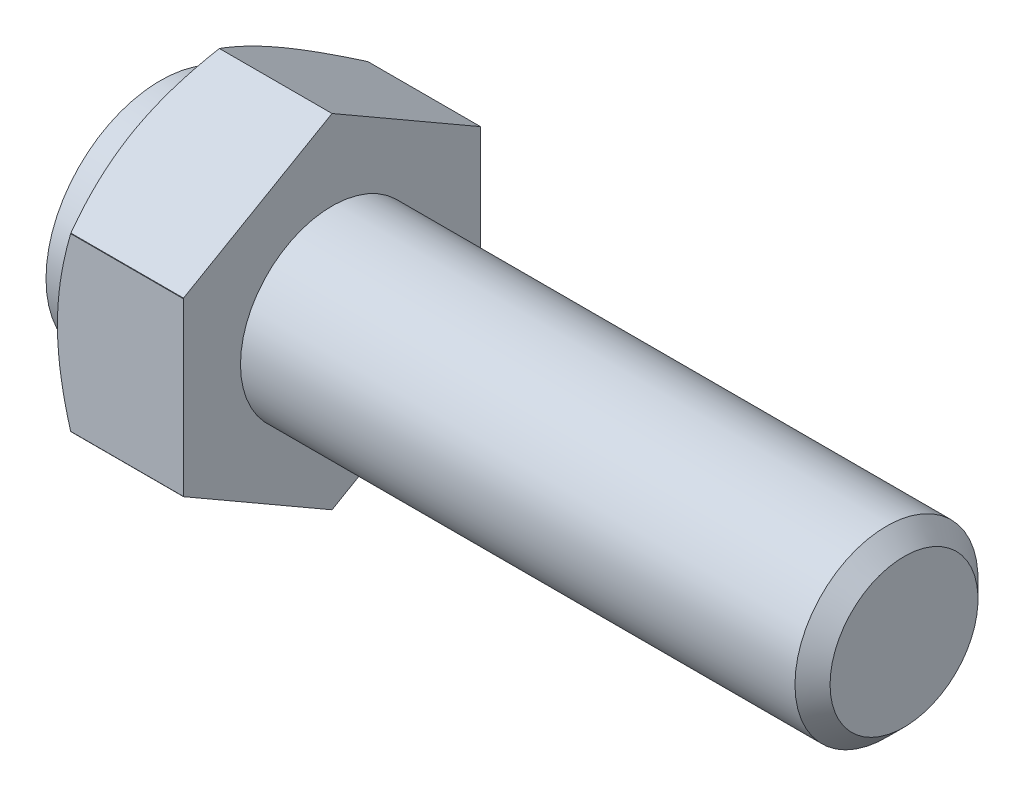
ISO-10303-21;
HEADER;
FILE_DESCRIPTION(('STEP AP214'),'2;1');
FILE_NAME('part.step','',(''),(''),'','','');
FILE_SCHEMA(('AUTOMOTIVE_DESIGN { 1 0 10303 214 1 1 1 1 }'));
ENDSEC;
DATA;
#1=APPLICATION_CONTEXT('core data for automotive mechanical design processes');
#2=APPLICATION_PROTOCOL_DEFINITION('international standard','automotive_design',2000,#1);
#3=PRODUCT_CONTEXT('',#1,'mechanical');
#4=PRODUCT('Part','Part','',(#3));
#5=PRODUCT_RELATED_PRODUCT_CATEGORY('part','',(#4));
#6=PRODUCT_DEFINITION_FORMATION('','',#4);
#7=PRODUCT_DEFINITION_CONTEXT('part definition',#1,'design');
#8=PRODUCT_DEFINITION('design','',#6,#7);
#9=PRODUCT_DEFINITION_SHAPE('','',#8);
#10=(LENGTH_UNIT() NAMED_UNIT(*) SI_UNIT(.MILLI.,.METRE.));
#11=(NAMED_UNIT(*) PLANE_ANGLE_UNIT() SI_UNIT($,.RADIAN.));
#12=(NAMED_UNIT(*) SI_UNIT($,.STERADIAN.) SOLID_ANGLE_UNIT());
#13=UNCERTAINTY_MEASURE_WITH_UNIT(LENGTH_MEASURE(1.E-05),#10,'distance_accuracy_value','');
#14=(GEOMETRIC_REPRESENTATION_CONTEXT(3) GLOBAL_UNCERTAINTY_ASSIGNED_CONTEXT((#13)) GLOBAL_UNIT_ASSIGNED_CONTEXT((#10,
#11,#12)) REPRESENTATION_CONTEXT('',''));
#15=CARTESIAN_POINT('',(0.,0.,0.));
#16=DIRECTION('',(0.,0.,1.));
#17=DIRECTION('',(1.,0.,0.));
#18=AXIS2_PLACEMENT_3D('',#15,#16,#17);
#19=CARTESIAN_POINT('',(-5.5,5.,0.));
#20=DIRECTION('',(1.,0.,0.));
#21=DIRECTION('',(0.,0.,-1.));
#22=AXIS2_PLACEMENT_3D('',#19,#20,#21);
#23=PLANE('',#22);
#24=CARTESIAN_POINT('',(-5.5,0.,0.));
#25=DIRECTION('',(-1.,0.,0.));
#26=DIRECTION('',(0.,0.,1.));
#27=AXIS2_PLACEMENT_3D('',#24,#25,#26);
#28=CIRCLE('',#27,5.);
#29=CARTESIAN_POINT('',(-5.5,0.,5.));
#30=VERTEX_POINT('',#29);
#31=EDGE_CURVE('E162',#30,#30,#28,.T.);
#32=ORIENTED_EDGE('',*,*,#31,.F.);
#33=EDGE_LOOP('',(#32));
#34=FACE_BOUND('',#33,.T.);
#35=DIRECTION('',(0.,-0.499444752972083,0.866345738564376));
#36=VECTOR('',#35,1.);
#37=CARTESIAN_POINT('',(-5.5,7.5,0.));
#38=LINE('',#37,#36);
#39=CARTESIAN_POINT('',(-5.5,5.71750123357074,3.09195401714145));
#40=VERTEX_POINT('',#39);
#41=CARTESIAN_POINT('',(-5.5,5.54082284735908,3.39842348364409));
#42=VERTEX_POINT('',#41);
#43=EDGE_CURVE('E42',#40,#42,#38,.T.);
#44=ORIENTED_EDGE('',*,*,#43,.F.);
#45=CARTESIAN_POINT('',(-5.5,0.,0.));
#46=DIRECTION('',(-1.,0.,0.));
#47=DIRECTION('',(0.,0.,1.));
#48=AXIS2_PLACEMENT_3D('',#45,#46,#47);
#49=CIRCLE('',#48,6.5);
#50=CARTESIAN_POINT('',(-5.5,5.71750123357073,-3.09195401714146));
#51=VERTEX_POINT('',#50);
#52=EDGE_CURVE('E242',#40,#51,#49,.T.);
#53=ORIENTED_EDGE('',*,*,#52,.T.);
#54=DIRECTION('',(0.,0.499444752972083,0.866345738564376));
#55=VECTOR('',#54,1.);
#56=CARTESIAN_POINT('',(-5.5,3.75277674973257,-6.5));
#57=LINE('',#56,#55);
#58=CARTESIAN_POINT('',(-5.5,5.5408228473591,-3.39842348364405));
#59=VERTEX_POINT('',#58);
#60=EDGE_CURVE('E178',#59,#51,#57,.T.);
#61=ORIENTED_EDGE('',*,*,#60,.F.);
#62=CARTESIAN_POINT('',(-5.5,0.,-6.5));
#63=VERTEX_POINT('',#62);
#64=EDGE_CURVE('E233',#59,#63,#49,.T.);
#65=ORIENTED_EDGE('',*,*,#64,.T.);
#66=CARTESIAN_POINT('',(-5.5,-5.54082284735908,-3.39842348364409));
#67=VERTEX_POINT('',#66);
#68=EDGE_CURVE('E236',#63,#67,#49,.T.);
#69=ORIENTED_EDGE('',*,*,#68,.T.);
#70=DIRECTION('',(0.,0.499444752972083,-0.866345738564376));
#71=VECTOR('',#70,1.);
#72=CARTESIAN_POINT('',(-5.5,-7.5,0.));
#73=LINE('',#72,#71);
#74=CARTESIAN_POINT('',(-5.5,-5.71750123357074,-3.09195401714145));
#75=VERTEX_POINT('',#74);
#76=EDGE_CURVE('E176',#75,#67,#73,.T.);
#77=ORIENTED_EDGE('',*,*,#76,.F.);
#78=CARTESIAN_POINT('',(-5.5,-5.71750123357073,3.09195401714146));
#79=VERTEX_POINT('',#78);
#80=EDGE_CURVE('E160',#75,#79,#49,.T.);
#81=ORIENTED_EDGE('',*,*,#80,.T.);
#82=DIRECTION('',(0.,-0.499444752972083,-0.866345738564376));
#83=VECTOR('',#82,1.);
#84=CARTESIAN_POINT('',(-5.5,-3.75277674973257,6.5));
#85=LINE('',#84,#83);
#86=CARTESIAN_POINT('',(-5.5,-5.5408228473591,3.39842348364405));
#87=VERTEX_POINT('',#86);
#88=EDGE_CURVE('E172',#87,#79,#85,.T.);
#89=ORIENTED_EDGE('',*,*,#88,.F.);
#90=CARTESIAN_POINT('',(-5.5,0.,6.5));
#91=VERTEX_POINT('',#90);
#92=EDGE_CURVE('E156',#87,#91,#49,.T.);
#93=ORIENTED_EDGE('',*,*,#92,.T.);
#94=EDGE_CURVE('E161',#91,#42,#49,.T.);
#95=ORIENTED_EDGE('',*,*,#94,.T.);
#96=EDGE_LOOP('',(#44,#53,#61,#65,#69,#77,#81,#89,#93,#95));
#97=FACE_BOUND('',#96,.T.);
#98=ADVANCED_FACE('F38',(#34,#97),#23,.F.);
#99=CARTESIAN_POINT('',(-4.92264973081037,0.,0.));
#100=DIRECTION('',(1.,0.,0.));
#101=DIRECTION('',(0.,0.,-1.));
#102=AXIS2_PLACEMENT_3D('',#99,#100,#101);
#103=CONICAL_SURFACE('',#102,7.5,1.0471975511966);
#104=CARTESIAN_POINT('',(-2.86380133186581,10.102980208265,-4.51517569776894));
#105=CARTESIAN_POINT('',(-2.9739356639875,9.98525603106327,-4.31096924923231));
#106=CARTESIAN_POINT('',(-3.08288066516859,9.86724998238417,-4.10627386142498));
#107=CARTESIAN_POINT('',(-3.29783343927706,9.63055528201522,-3.69569903050495));
#108=CARTESIAN_POINT('',(-3.40384084164709,9.51186654646902,-3.48981944193353));
#109=CARTESIAN_POINT('',(-3.6126669221049,9.27333445138019,-3.07605743350055));
#110=CARTESIAN_POINT('',(-3.71547425761391,9.15348860700929,-2.86817070341175));
#111=CARTESIAN_POINT('',(-3.91677539363357,8.9128985769503,-2.45083896443093));
#112=CARTESIAN_POINT('',(-4.01526933132566,8.79215441997484,-2.24139400534436));
#113=CARTESIAN_POINT('',(-4.20943195731407,8.54654648992904,-1.81535812792934));
#114=CARTESIAN_POINT('',(-4.30496548916255,8.42165593954939,-1.59872076120458));
#115=CARTESIAN_POINT('',(-4.48922042129194,8.17061464657245,-1.16326007595353));
#116=CARTESIAN_POINT('',(-4.57794148865461,8.04446384272786,-0.944436651186592));
#117=CARTESIAN_POINT('',(-4.74688101006331,7.79087299726346,-0.50455346691115));
#118=CARTESIAN_POINT('',(-4.82710767013965,7.66343433263208,-0.283496095951239));
#119=CARTESIAN_POINT('',(-4.97720499092093,7.40706079741462,0.161213991389984));
#120=CARTESIAN_POINT('',(-5.04707698848663,7.27812612229594,0.384866368710066));
#121=CARTESIAN_POINT('',(-5.19820163120515,6.96975356433922,0.919774884389156));
#122=CARTESIAN_POINT('',(-5.27381771705955,6.78959706098684,1.2322775546549));
#123=CARTESIAN_POINT('',(-5.36466840268587,6.51751661186548,1.70423313380611));
#124=CARTESIAN_POINT('',(-5.39118946882856,6.42651705295643,1.86208258482737));
#125=CARTESIAN_POINT('',(-5.43603982848086,6.2440197627889,2.17864562547467));
#126=CARTESIAN_POINT('',(-5.45437022209799,6.15252210010379,2.33735909615213));
#127=CARTESIAN_POINT('',(-5.48215434446047,5.97025128035055,2.65352929719674));
#128=CARTESIAN_POINT('',(-5.49170804912341,5.87948194414424,2.81097939982912));
#129=CARTESIAN_POINT('',(-5.50201589672274,5.6978182728382,3.12609643039434));
#130=CARTESIAN_POINT('',(-5.50277013114501,5.60692393904787,3.28376335605588));
#131=CARTESIAN_POINT('',(-5.49545499753871,5.42522467476356,3.59894212683335));
#132=CARTESIAN_POINT('',(-5.48738566544431,5.33441974390698,3.75645397257823));
#133=CARTESIAN_POINT('',(-5.46266756854949,5.15309236874645,4.07098765787691));
#134=CARTESIAN_POINT('',(-5.44601749744787,5.06256996956567,4.22800941915922));
#135=CARTESIAN_POINT('',(-5.39695873160083,4.84867292069102,4.5990390389146));
#136=CARTESIAN_POINT('',(-5.36100237129721,4.72549968761225,4.81269751654996));
#137=CARTESIAN_POINT('',(-5.27555649758671,4.48033320823007,5.23796764580379));
#138=CARTESIAN_POINT('',(-5.22606500616289,4.35834013709493,5.44957899357225));
#139=CARTESIAN_POINT('',(-5.1154173199135,4.11554861568663,5.87072947854572));
#140=CARTESIAN_POINT('',(-5.05424792708402,3.9947516813065,6.08026598625574));
#141=CARTESIAN_POINT('',(-4.92217129515758,3.75451417855719,6.49698622510435));
#142=CARTESIAN_POINT('',(-4.85126467396609,3.63507352464141,6.70417010463359));
#143=CARTESIAN_POINT('',(-4.70050433810487,3.39604993504458,7.118784668169));
#144=CARTESIAN_POINT('',(-4.62055392765062,3.27648231951587,7.32618877756686));
#145=CARTESIAN_POINT('',(-4.45394592653031,3.03861378268059,7.73879976606853));
#146=CARTESIAN_POINT('',(-4.36729278765593,2.92031207903058,7.9440080022392));
#147=CARTESIAN_POINT('',(-4.18846874847785,2.68478673562873,8.35255444579649));
#148=CARTESIAN_POINT('',(-4.09629901231353,2.56756287440657,8.55589303734951));
#149=CARTESIAN_POINT('',(-3.90740756080311,2.33403398373776,8.96097639853939));
#150=CARTESIAN_POINT('',(-3.81068576311745,2.21772897095611,9.16272113926889));
#151=CARTESIAN_POINT('',(-3.64365592793772,2.02139142837293,9.50329172755706));
#152=CARTESIAN_POINT('',(-3.57432307360361,1.94115108119484,9.64247805882792));
#153=CARTESIAN_POINT('',(-3.43406336540674,1.78102184473308,9.92024107626414));
#154=CARTESIAN_POINT('',(-3.3631365637484,1.70113294404113,10.0588177822185));
#155=CARTESIAN_POINT('',(-3.22063274733562,1.54251177636479,10.3339648767565));
#156=CARTESIAN_POINT('',(-3.14907048529663,1.46377619839329,10.4705410086371));
#157=CARTESIAN_POINT('',(-3.00472061590374,1.30658397762761,10.743209426486));
#158=CARTESIAN_POINT('',(-2.93193298752434,1.22812733964767,10.8793017041033));
#159=CARTESIAN_POINT('',(-2.85860941432732,1.1497965414676,11.0151756977689));
#160=B_SPLINE_CURVE_WITH_KNOTS('',3,(#104,#105,#106,#107,#108,#109,#110,#111,#112,#113,#114,
#115,#116,#117,#118,#119,#120,#121,#122,#123,#124,#125,#126,#127,#128,#129,#130,#131,#132,#133,
#134,#135,#136,#137,#138,#139,#140,#141,#142,#143,#144,#145,#146,#147,#148,#149,#150,#151,#152,
#153,#154,#155,#156,#157,#158,#159),.UNSPECIFIED.,.F.,.F.,(4,2,2,2,2,2,2,2,2,2,2,2,2,2,2,2,2,2,
2,2,2,2,2,2,2,2,2,4),(0.,0.780520662693697,1.56113933846674,2.34426671774731,3.12736917266732,
3.93034749844419,4.73336504001876,5.53559960837084,6.33773051211705,7.4421914672065,
7.99440344458687,8.5465412308337,9.09230863417496,9.63807036330422,10.1838298698139,
10.7296724853648,11.4769033173922,12.2242434077458,12.972433173141,13.7205754817989,
14.4776481541645,15.2342222446987,15.9906372383531,16.7470659196147,17.2720008545213,
17.7969186219227,18.3162988401756,18.835687979334),.UNSPECIFIED.);
#161=CARTESIAN_POINT('',(-4.92264973081037,3.75832408092982,6.49037750078553));
#162=VERTEX_POINT('',#161);
#163=EDGE_CURVE('E103',#42,#162,#160,.T.);
#164=ORIENTED_EDGE('',*,*,#163,.F.);
#165=ORIENTED_EDGE('',*,*,#94,.F.);
#166=CARTESIAN_POINT('',(-2.38979138667345,-9.95247226977753,6.5));
#167=CARTESIAN_POINT('',(-2.52770251142971,-9.66708897694808,6.5));
#168=CARTESIAN_POINT('',(-2.66424254859783,-9.38103089143688,6.5));
#169=CARTESIAN_POINT('',(-2.93379695207553,-8.80720027773985,6.5));
#170=CARTESIAN_POINT('',(-3.06681070784964,-8.51942746309613,6.5));
#171=CARTESIAN_POINT('',(-3.32922987365981,-7.94024778876697,6.5));
#172=CARTESIAN_POINT('',(-3.45861027445128,-7.64882955664635,6.5));
#173=CARTESIAN_POINT('',(-3.71181322906023,-7.06359770999091,6.5));
#174=CARTESIAN_POINT('',(-3.83563607262056,-6.76978422127852,6.5));
#175=CARTESIAN_POINT('',(-4.07771525525277,-6.17564924399771,6.5));
#176=CARTESIAN_POINT('',(-4.19588465297657,-5.87529213661735,6.5));
#177=CARTESIAN_POINT('',(-4.42296727160603,-5.27103479641267,6.5));
#178=CARTESIAN_POINT('',(-4.53187946264124,-4.96713417363553,6.5));
#179=CARTESIAN_POINT('',(-4.73752120504959,-4.35593172125217,6.5));
#180=CARTESIAN_POINT('',(-4.83427666052139,-4.04863869549445,6.5));
#181=CARTESIAN_POINT('',(-5.01246121355704,-3.42968091180101,6.5));
#182=CARTESIAN_POINT('',(-5.09389515831622,-3.1180175701241,6.5));
#183=CARTESIAN_POINT('',(-5.23748724126729,-2.49012111218435,6.5));
#184=CARTESIAN_POINT('',(-5.29964022336022,-2.17388679717722,6.5));
#185=CARTESIAN_POINT('',(-5.40046966859335,-1.53756167533449,6.5));
#186=CARTESIAN_POINT('',(-5.43914611048653,-1.2174708650089,6.5));
#187=CARTESIAN_POINT('',(-5.47707400630317,-0.736825531689956,6.5));
#188=CARTESIAN_POINT('',(-5.4863707823203,-0.577023099435243,6.5));
#189=CARTESIAN_POINT('',(-5.49819292322392,-0.257160598468338,6.5));
#190=CARTESIAN_POINT('',(-5.50071837599742,-0.0971005331270236,6.5));
#191=CARTESIAN_POINT('',(-5.49893001850115,0.222935074442617,6.5));
#192=CARTESIAN_POINT('',(-5.49461812710233,0.382910627785604,6.5));
#193=CARTESIAN_POINT('',(-5.47926434420752,0.70254108934795,6.5));
#194=CARTESIAN_POINT('',(-5.46822211678986,0.862195981163505,6.5));
#195=CARTESIAN_POINT('',(-5.43353125453739,1.2491644310346,6.5));
#196=CARTESIAN_POINT('',(-5.40650941689791,1.47618048505766,6.5));
#197=CARTESIAN_POINT('',(-5.34035726028707,1.92847275028861,6.5));
#198=CARTESIAN_POINT('',(-5.30122363598703,2.15374846933394,6.5));
#199=CARTESIAN_POINT('',(-5.21223578903067,2.60237423758464,6.5));
#200=CARTESIAN_POINT('',(-5.16237142887794,2.82572225669061,6.5));
#201=CARTESIAN_POINT('',(-5.05344352298376,3.27012022487474,6.5));
#202=CARTESIAN_POINT('',(-4.99438084390286,3.49117038836461,6.5));
#203=CARTESIAN_POINT('',(-4.86692556085139,3.93641644141958,6.5));
#204=CARTESIAN_POINT('',(-4.79833976811922,4.16055664665527,6.5));
#205=CARTESIAN_POINT('',(-4.65439245813578,4.60646788047676,6.5));
#206=CARTESIAN_POINT('',(-4.5790356147292,4.82824042686378,6.5));
#207=CARTESIAN_POINT('',(-4.423102693128,5.26852644152522,6.5));
#208=CARTESIAN_POINT('',(-4.34255838141048,5.48705122810415,6.5));
#209=CARTESIAN_POINT('',(-4.17674287717808,5.92240543261583,6.5));
#210=CARTESIAN_POINT('',(-4.09146977384419,6.13923412420626,6.5));
#211=CARTESIAN_POINT('',(-4.00430007734791,6.35527514287914,6.5));
#212=B_SPLINE_CURVE_WITH_KNOTS('',3,(#166,#167,#168,#169,#170,#171,#172,#173,#174,#175,#176,
#177,#178,#179,#180,#181,#182,#183,#184,#185,#186,#187,#188,#189,#190,#191,#192,#193,#194,#195,
#196,#197,#198,#199,#200,#201,#202,#203,#204,#205,#206,#207,#208,#209,#210,#211),.UNSPECIFIED.,
.F.,.F.,(4,2,2,2,2,2,2,2,2,2,2,2,2,2,2,2,2,2,2,2,2,2,4),(0.,0.95089021712034,1.90194400883154,
2.85844107405992,3.8148882143212,4.78307078869388,5.7513609334288,6.71755149045085,
7.68343586236786,8.64957830805971,9.61572162813983,10.0958176417558,10.5759074240338,
11.0558624950443,11.5358415233302,12.2213154884888,12.9069766859365,13.5932885045242,
14.2795356982671,14.9826021305605,15.685186932542,16.3838169223534,17.0827313026242),.UNSPECIFIED.);
#213=CARTESIAN_POINT('',(-4.92264973081037,3.74165738677394,6.5));
#214=VERTEX_POINT('',#213);
#215=EDGE_CURVE('E253',#214,#91,#212,.F.);
#216=ORIENTED_EDGE('',*,*,#215,.F.);
#217=CARTESIAN_POINT('',(-4.92264973081037,0.,0.));
#218=DIRECTION('',(-1.,0.,0.));
#219=DIRECTION('',(0.,0.,1.));
#220=AXIS2_PLACEMENT_3D('',#217,#218,#219);
#221=CIRCLE('',#220,7.5);
#222=EDGE_CURVE('E153',#214,#162,#221,.T.);
#223=ORIENTED_EDGE('',*,*,#222,.T.);
#224=EDGE_LOOP('',(#164,#165,#216,#223));
#225=FACE_BOUND('',#224,.T.);
#226=ADVANCED_FACE('F199',(#225),#103,.T.);
#227=CARTESIAN_POINT('',(-2.85860941432731,1.1497965414676,-11.0151756977689));
#228=CARTESIAN_POINT('',(-2.96882208023017,1.26755410252669,-10.8109113410004));
#229=CARTESIAN_POINT('',(-3.07784780587338,1.38559307630773,-10.6061588407265));
#230=CARTESIAN_POINT('',(-3.2929680891363,1.62235251713118,-10.1954717098643));
#231=CARTESIAN_POINT('',(-3.39906227869338,1.74107306750777,-9.98953693472306));
#232=CARTESIAN_POINT('',(-3.60806831206244,1.97966616405338,-9.57566911207977));
#233=CARTESIAN_POINT('',(-3.71096888336292,2.0995411811746,-9.36773177842017));
#234=CARTESIAN_POINT('',(-3.91246587107231,2.34018826420314,-8.95030107434512));
#235=CARTESIAN_POINT('',(-4.01106242380182,2.46096030155728,-8.74080775345853));
#236=CARTESIAN_POINT('',(-4.20545887039183,2.70664145207412,-8.31464486651405));
#237=CARTESIAN_POINT('',(-4.30112309975289,2.83157746724038,-8.09792863576299));
#238=CARTESIAN_POINT('',(-4.48565199557464,3.08270876643472,-7.66231182412875));
#239=CARTESIAN_POINT('',(-4.57451633016838,3.20890411158472,-7.4434111372224));
#240=CARTESIAN_POINT('',(-4.74375727219499,3.46258411170219,-7.00337330370237));
#241=CARTESIAN_POINT('',(-4.82414203271184,3.59006739663755,-6.78223853357073));
#242=CARTESIAN_POINT('',(-4.97457141362716,3.84653069691589,-6.33737273816069));
#243=CARTESIAN_POINT('',(-5.04461736600005,3.9755105171431,-6.11364205133358));
#244=CARTESIAN_POINT('',(-5.19613384095073,4.2839099112205,-5.57868698524297));
#245=CARTESIAN_POINT('',(-5.27198594514242,4.46404749240498,-5.2662171377057));
#246=CARTESIAN_POINT('',(-5.36322780422519,4.73610498006047,-4.79430138792099));
#247=CARTESIAN_POINT('',(-5.389885453727,4.82709781162544,-4.63646360627024));
#248=CARTESIAN_POINT('',(-5.4350189726686,5.00958423124228,-4.31991942187322));
#249=CARTESIAN_POINT('',(-5.45349594050526,5.1010777503972,-4.16121313863682));
#250=CARTESIAN_POINT('',(-5.48157763786884,5.28334046405292,-3.84505699857294));
#251=CARTESIAN_POINT('',(-5.49128256641375,5.37410578781462,-3.68761385599825));
#252=CARTESIAN_POINT('',(-5.50189564870459,5.55576509562505,-3.37250439443));
#253=CARTESIAN_POINT('',(-5.50280389609682,5.64665907829383,-3.21483807783013));
#254=CARTESIAN_POINT('',(-5.49579487619956,5.82836107614401,-2.89965456536077));
#255=CARTESIAN_POINT('',(-5.48787767289141,5.91916909194386,-2.7421373684185));
#256=CARTESIAN_POINT('',(-5.46345756329406,6.10050597235057,-2.42758719515099));
#257=CARTESIAN_POINT('',(-5.44695335153596,6.19103479240609,-2.27055429610531));
#258=CARTESIAN_POINT('',(-5.39828122860516,6.40471893205436,-1.89989399247525));
#259=CARTESIAN_POINT('',(-5.36258985289117,6.52767559457986,-1.68661118196783));
#260=CARTESIAN_POINT('',(-5.27769767686692,6.77241657904228,-1.26207912375855));
#261=CARTESIAN_POINT('',(-5.2284949172021,6.89420072829382,-1.0508301755998));
#262=CARTESIAN_POINT('',(-5.11843690415824,7.13657990856658,-0.630394944883157));
#263=CARTESIAN_POINT('',(-5.05756850852729,7.25717343558557,-0.421211271194251));
#264=CARTESIAN_POINT('',(-4.92609739768044,7.49700859211857,-0.00518894923805748));
#265=CARTESIAN_POINT('',(-4.85549529717898,7.61625030648961,0.20164984622374));
#266=CARTESIAN_POINT('',(-4.70534505387263,7.85487840979543,0.615578392214996));
#267=CARTESIAN_POINT('',(-4.62570006689022,7.9742494917008,0.822641590899402));
#268=CARTESIAN_POINT('',(-4.45969833986255,8.21172684162516,1.23457401963797));
#269=CARTESIAN_POINT('',(-4.37334604644746,8.32983388952787,1.43944460249232));
#270=CARTESIAN_POINT('',(-4.19511810956887,8.56497090627377,1.84731744773559));
#271=CARTESIAN_POINT('',(-4.10324362207282,8.68200109466355,2.05032009095395));
#272=CARTESIAN_POINT('',(-3.91493702842203,8.91514283400024,2.4547318925674));
#273=CARTESIAN_POINT('',(-3.81850483903076,9.03125436812467,2.65614102178193));
#274=CARTESIAN_POINT('',(-3.65155421510831,9.22774281150441,2.99697336527179));
#275=CARTESIAN_POINT('',(-3.58200151382939,9.30832526687439,3.13675312348808));
#276=CARTESIAN_POINT('',(-3.44128186531019,9.46913451315657,3.41569569803566));
#277=CARTESIAN_POINT('',(-3.37011497265305,9.54936131598566,3.5548585350382));
#278=CARTESIAN_POINT('',(-3.22712108089374,9.70864614233129,3.83115682369039));
#279=CARTESIAN_POINT('',(-3.15530910122181,9.78770753424051,3.96829811821383));
#280=CARTESIAN_POINT('',(-3.01044576654169,9.94554840425098,4.24209169456261));
#281=CARTESIAN_POINT('',(-2.93739438942475,10.0243278772928,4.37874396761188));
#282=CARTESIAN_POINT('',(-2.86380133186582,10.102980208265,4.51517569776894));
#283=B_SPLINE_CURVE_WITH_KNOTS('',3,(#227,#228,#229,#230,#231,#232,#233,#234,#235,#236,#237,
#238,#239,#240,#241,#242,#243,#244,#245,#246,#247,#248,#249,#250,#251,#252,#253,#254,#255,#256,
#257,#258,#259,#260,#261,#262,#263,#264,#265,#266,#267,#268,#269,#270,#271,#272,#273,#274,#275,
#276,#277,#278,#279,#280,#281,#282),.UNSPECIFIED.,.F.,.F.,(4,2,2,2,2,2,2,2,2,2,2,2,2,2,2,2,2,2,
2,2,2,2,2,2,2,2,2,4),(0.,0.780801786669926,1.56170116382501,2.3450999449127,3.12847389548585,
3.93184762796722,4.73526054390602,5.53789380138463,6.34042356319322,7.444923095913,
7.99715463515725,8.54931200534027,9.09507956530925,9.64084131522645,10.1865991085926,
10.7324398968811,11.4782703796126,12.2242090761866,12.9709931240963,13.717730031801,
14.4733926192123,15.2285584447741,15.9835667374348,16.7385888240163,17.2656716591284,
17.7927366976689,18.3142085333171,18.8356896809444),.UNSPECIFIED.);
#284=CARTESIAN_POINT('',(-4.92264973081037,3.75832408092982,-6.49037750078553));
#285=VERTEX_POINT('',#284);
#286=EDGE_CURVE('E180',#285,#59,#283,.T.);
#287=ORIENTED_EDGE('',*,*,#286,.F.);
#288=CARTESIAN_POINT('',(-4.92264973081037,3.74165738677394,-6.5));
#289=VERTEX_POINT('',#288);
#290=EDGE_CURVE('E157',#285,#289,#221,.T.);
#291=ORIENTED_EDGE('',*,*,#290,.T.);
#292=CARTESIAN_POINT('',(-2.38979138667345,-9.95247226977753,-6.5));
#293=CARTESIAN_POINT('',(-2.52770251142971,-9.66708897694808,-6.5));
#294=CARTESIAN_POINT('',(-2.66424254859783,-9.38103089143688,-6.5));
#295=CARTESIAN_POINT('',(-2.93379695207553,-8.80720027773985,-6.5));
#296=CARTESIAN_POINT('',(-3.06681070784964,-8.51942746309613,-6.5));
#297=CARTESIAN_POINT('',(-3.32922987365981,-7.94024778876697,-6.5));
#298=CARTESIAN_POINT('',(-3.45861027445128,-7.64882955664635,-6.5));
#299=CARTESIAN_POINT('',(-3.71181322906023,-7.06359770999091,-6.5));
#300=CARTESIAN_POINT('',(-3.83563607262056,-6.76978422127852,-6.5));
#301=CARTESIAN_POINT('',(-4.07771525525277,-6.17564924399771,-6.5));
#302=CARTESIAN_POINT('',(-4.19588465297657,-5.87529213661735,-6.5));
#303=CARTESIAN_POINT('',(-4.42296727160603,-5.27103479641267,-6.5));
#304=CARTESIAN_POINT('',(-4.53187946264124,-4.96713417363553,-6.5));
#305=CARTESIAN_POINT('',(-4.73752120504959,-4.35593172125217,-6.5));
#306=CARTESIAN_POINT('',(-4.83427666052139,-4.04863869549445,-6.5));
#307=CARTESIAN_POINT('',(-5.01246121355704,-3.42968091180101,-6.5));
#308=CARTESIAN_POINT('',(-5.09389515831622,-3.1180175701241,-6.5));
#309=CARTESIAN_POINT('',(-5.23748724126729,-2.49012111218435,-6.5));
#310=CARTESIAN_POINT('',(-5.29964022336022,-2.17388679717722,-6.5));
#311=CARTESIAN_POINT('',(-5.40046966859335,-1.53756167533449,-6.5));
#312=CARTESIAN_POINT('',(-5.43914611048653,-1.2174708650089,-6.5));
#313=CARTESIAN_POINT('',(-5.47707400630317,-0.736825531689956,-6.5));
#314=CARTESIAN_POINT('',(-5.4863707823203,-0.577023099435243,-6.5));
#315=CARTESIAN_POINT('',(-5.49819292322392,-0.257160598468338,-6.5));
#316=CARTESIAN_POINT('',(-5.50071837599742,-0.0971005331270236,-6.5));
#317=CARTESIAN_POINT('',(-5.49893001850115,0.222935074442617,-6.5));
#318=CARTESIAN_POINT('',(-5.49461812710233,0.382910627785604,-6.5));
#319=CARTESIAN_POINT('',(-5.47926434420752,0.70254108934795,-6.5));
#320=CARTESIAN_POINT('',(-5.46822211678986,0.862195981163505,-6.5));
#321=CARTESIAN_POINT('',(-5.43353125453739,1.2491644310346,-6.5));
#322=CARTESIAN_POINT('',(-5.40650941689791,1.47618048505766,-6.5));
#323=CARTESIAN_POINT('',(-5.34035726028707,1.92847275028861,-6.5));
#324=CARTESIAN_POINT('',(-5.30122363598703,2.15374846933394,-6.5));
#325=CARTESIAN_POINT('',(-5.21223578903067,2.60237423758464,-6.5));
#326=CARTESIAN_POINT('',(-5.16237142887794,2.82572225669061,-6.5));
#327=CARTESIAN_POINT('',(-5.05344352298376,3.27012022487474,-6.5));
#328=CARTESIAN_POINT('',(-4.99438084390286,3.49117038836461,-6.5));
#329=CARTESIAN_POINT('',(-4.86692556085139,3.93641644141958,-6.5));
#330=CARTESIAN_POINT('',(-4.79833976811922,4.16055664665527,-6.5));
#331=CARTESIAN_POINT('',(-4.65439245813578,4.60646788047676,-6.5));
#332=CARTESIAN_POINT('',(-4.5790356147292,4.82824042686378,-6.5));
#333=CARTESIAN_POINT('',(-4.423102693128,5.26852644152522,-6.5));
#334=CARTESIAN_POINT('',(-4.34255838141048,5.48705122810415,-6.5));
#335=CARTESIAN_POINT('',(-4.17674287717808,5.92240543261583,-6.5));
#336=CARTESIAN_POINT('',(-4.09146977384419,6.13923412420626,-6.5));
#337=CARTESIAN_POINT('',(-4.00430007734791,6.35527514287914,-6.5));
#338=B_SPLINE_CURVE_WITH_KNOTS('',3,(#292,#293,#294,#295,#296,#297,#298,#299,#300,#301,#302,
#303,#304,#305,#306,#307,#308,#309,#310,#311,#312,#313,#314,#315,#316,#317,#318,#319,#320,#321,
#322,#323,#324,#325,#326,#327,#328,#329,#330,#331,#332,#333,#334,#335,#336,#337),.UNSPECIFIED.,
.F.,.F.,(4,2,2,2,2,2,2,2,2,2,2,2,2,2,2,2,2,2,2,2,2,2,4),(0.,0.95089021712034,1.90194400883154,
2.85844107405992,3.8148882143212,4.78307078869388,5.7513609334288,6.71755149045085,
7.68343586236786,8.64957830805971,9.61572162813983,10.0958176417558,10.5759074240338,
11.0558624950443,11.5358415233302,12.2213154884888,12.9069766859365,13.5932885045242,
14.2795356982671,14.9826021305605,15.685186932542,16.3838169223534,17.0827313026242),.UNSPECIFIED.);
#339=EDGE_CURVE('E120',#63,#289,#338,.T.);
#340=ORIENTED_EDGE('',*,*,#339,.F.);
#341=ORIENTED_EDGE('',*,*,#64,.F.);
#342=EDGE_LOOP('',(#287,#291,#340,#341));
#343=FACE_BOUND('',#342,.T.);
#344=ADVANCED_FACE('F231',(#343),#103,.T.);
#345=CARTESIAN_POINT('',(-4.92264973081037,7.5,0.));
#346=VERTEX_POINT('',#345);
#347=EDGE_CURVE('E94',#346,#40,#160,.T.);
#348=ORIENTED_EDGE('',*,*,#347,.F.);
#349=EDGE_CURVE('E179',#51,#346,#283,.T.);
#350=ORIENTED_EDGE('',*,*,#349,.F.);
#351=ORIENTED_EDGE('',*,*,#52,.F.);
#352=EDGE_LOOP('',(#348,#350,#351));
#353=FACE_BOUND('',#352,.T.);
#354=ADVANCED_FACE('F356',(#353),#103,.T.);
#355=CARTESIAN_POINT('',(-4.92264973081037,-3.74165738677394,-6.5));
#356=VERTEX_POINT('',#355);
#357=EDGE_CURVE('E219',#356,#63,#338,.T.);
#358=ORIENTED_EDGE('',*,*,#357,.F.);
#359=CARTESIAN_POINT('',(-4.92264973081037,-3.75832408092982,-6.49037750078553));
#360=VERTEX_POINT('',#359);
#361=EDGE_CURVE('E280',#356,#360,#221,.T.);
#362=ORIENTED_EDGE('',*,*,#361,.T.);
#363=CARTESIAN_POINT('',(-2.86380133186581,-10.102980208265,4.51517569776894));
#364=CARTESIAN_POINT('',(-2.9739356639875,-9.98525603106327,4.31096924923231));
#365=CARTESIAN_POINT('',(-3.08288066516859,-9.86724998238417,4.10627386142498));
#366=CARTESIAN_POINT('',(-3.29783343927706,-9.63055528201522,3.69569903050495));
#367=CARTESIAN_POINT('',(-3.40384084164709,-9.51186654646902,3.48981944193353));
#368=CARTESIAN_POINT('',(-3.6126669221049,-9.27333445138019,3.07605743350055));
#369=CARTESIAN_POINT('',(-3.71547425761391,-9.15348860700929,2.86817070341175));
#370=CARTESIAN_POINT('',(-3.91677539363357,-8.9128985769503,2.45083896443093));
#371=CARTESIAN_POINT('',(-4.01526933132566,-8.79215441997484,2.24139400534436));
#372=CARTESIAN_POINT('',(-4.20943195731407,-8.54654648992904,1.81535812792934));
#373=CARTESIAN_POINT('',(-4.30496548916255,-8.42165593954939,1.59872076120458));
#374=CARTESIAN_POINT('',(-4.48922042129194,-8.17061464657245,1.16326007595353));
#375=CARTESIAN_POINT('',(-4.57794148865461,-8.04446384272786,0.944436651186592));
#376=CARTESIAN_POINT('',(-4.74688101006331,-7.79087299726346,0.50455346691115));
#377=CARTESIAN_POINT('',(-4.82710767013965,-7.66343433263208,0.283496095951239));
#378=CARTESIAN_POINT('',(-4.97720499092093,-7.40706079741462,-0.161213991389984));
#379=CARTESIAN_POINT('',(-5.04707698848663,-7.27812612229594,-0.384866368710066));
#380=CARTESIAN_POINT('',(-5.19820163120515,-6.96975356433922,-0.919774884389156));
#381=CARTESIAN_POINT('',(-5.27381771705955,-6.78959706098684,-1.2322775546549));
#382=CARTESIAN_POINT('',(-5.36466840268587,-6.51751661186548,-1.70423313380611));
#383=CARTESIAN_POINT('',(-5.39118946882856,-6.42651705295643,-1.86208258482737));
#384=CARTESIAN_POINT('',(-5.43603982848086,-6.2440197627889,-2.17864562547467));
#385=CARTESIAN_POINT('',(-5.45437022209799,-6.15252210010379,-2.33735909615213));
#386=CARTESIAN_POINT('',(-5.48215434446047,-5.97025128035055,-2.65352929719674));
#387=CARTESIAN_POINT('',(-5.49170804912341,-5.87948194414424,-2.81097939982912));
#388=CARTESIAN_POINT('',(-5.50201589672274,-5.6978182728382,-3.12609643039434));
#389=CARTESIAN_POINT('',(-5.50277013114501,-5.60692393904787,-3.28376335605588));
#390=CARTESIAN_POINT('',(-5.49545499753871,-5.42522467476356,-3.59894212683335));
#391=CARTESIAN_POINT('',(-5.48738566544431,-5.33441974390698,-3.75645397257823));
#392=CARTESIAN_POINT('',(-5.46266756854949,-5.15309236874645,-4.07098765787691));
#393=CARTESIAN_POINT('',(-5.44601749744787,-5.06256996956567,-4.22800941915922));
#394=CARTESIAN_POINT('',(-5.39695873160083,-4.84867292069102,-4.5990390389146));
#395=CARTESIAN_POINT('',(-5.36100237129721,-4.72549968761225,-4.81269751654996));
#396=CARTESIAN_POINT('',(-5.27555649758671,-4.48033320823007,-5.23796764580379));
#397=CARTESIAN_POINT('',(-5.22606500616289,-4.35834013709493,-5.44957899357225));
#398=CARTESIAN_POINT('',(-5.1154173199135,-4.11554861568663,-5.87072947854572));
#399=CARTESIAN_POINT('',(-5.05424792708402,-3.9947516813065,-6.08026598625574));
#400=CARTESIAN_POINT('',(-4.92217129515758,-3.75451417855719,-6.49698622510435));
#401=CARTESIAN_POINT('',(-4.85126467396609,-3.63507352464141,-6.70417010463359));
#402=CARTESIAN_POINT('',(-4.70050433810487,-3.39604993504458,-7.118784668169));
#403=CARTESIAN_POINT('',(-4.62055392765062,-3.27648231951587,-7.32618877756686));
#404=CARTESIAN_POINT('',(-4.45394592653031,-3.03861378268059,-7.73879976606853));
#405=CARTESIAN_POINT('',(-4.36729278765593,-2.92031207903058,-7.9440080022392));
#406=CARTESIAN_POINT('',(-4.18846874847785,-2.68478673562873,-8.35255444579649));
#407=CARTESIAN_POINT('',(-4.09629901231353,-2.56756287440657,-8.55589303734951));
#408=CARTESIAN_POINT('',(-3.90740756080311,-2.33403398373776,-8.96097639853939));
#409=CARTESIAN_POINT('',(-3.81068576311745,-2.21772897095611,-9.16272113926889));
#410=CARTESIAN_POINT('',(-3.64365592793772,-2.02139142837293,-9.50329172755706));
#411=CARTESIAN_POINT('',(-3.57432307360361,-1.94115108119484,-9.64247805882792));
#412=CARTESIAN_POINT('',(-3.43406336540674,-1.78102184473308,-9.92024107626414));
#413=CARTESIAN_POINT('',(-3.3631365637484,-1.70113294404113,-10.0588177822185));
#414=CARTESIAN_POINT('',(-3.22063274733562,-1.54251177636479,-10.3339648767565));
#415=CARTESIAN_POINT('',(-3.14907048529663,-1.46377619839329,-10.4705410086371));
#416=CARTESIAN_POINT('',(-3.00472061590374,-1.30658397762761,-10.743209426486));
#417=CARTESIAN_POINT('',(-2.93193298752434,-1.22812733964767,-10.8793017041033));
#418=CARTESIAN_POINT('',(-2.85860941432732,-1.1497965414676,-11.0151756977689));
#419=B_SPLINE_CURVE_WITH_KNOTS('',3,(#363,#364,#365,#366,#367,#368,#369,#370,#371,#372,#373,
#374,#375,#376,#377,#378,#379,#380,#381,#382,#383,#384,#385,#386,#387,#388,#389,#390,#391,#392,
#393,#394,#395,#396,#397,#398,#399,#400,#401,#402,#403,#404,#405,#406,#407,#408,#409,#410,#411,
#412,#413,#414,#415,#416,#417,#418),.UNSPECIFIED.,.F.,.F.,(4,2,2,2,2,2,2,2,2,2,2,2,2,2,2,2,2,2,
2,2,2,2,2,2,2,2,2,4),(0.,0.780520662693697,1.56113933846674,2.34426671774731,3.12736917266732,
3.93034749844419,4.73336504001876,5.53559960837084,6.33773051211705,7.4421914672065,
7.99440344458687,8.5465412308337,9.09230863417496,9.63807036330422,10.1838298698139,
10.7296724853648,11.4769033173922,12.2242434077458,12.972433173141,13.7205754817989,
14.4776481541645,15.2342222446987,15.9906372383531,16.7470659196147,17.2720008545213,
17.7969186219227,18.3162988401756,18.835687979334),.UNSPECIFIED.);
#420=EDGE_CURVE('E177',#67,#360,#419,.T.);
#421=ORIENTED_EDGE('',*,*,#420,.F.);
#422=ORIENTED_EDGE('',*,*,#68,.F.);
#423=EDGE_LOOP('',(#358,#362,#421,#422));
#424=FACE_BOUND('',#423,.T.);
#425=ADVANCED_FACE('F237',(#424),#103,.T.);
#426=CARTESIAN_POINT('',(-2.85860941432731,-1.1497965414676,11.0151756977689));
#427=CARTESIAN_POINT('',(-2.96882208023017,-1.26755410252669,10.8109113410004));
#428=CARTESIAN_POINT('',(-3.07784780587338,-1.38559307630773,10.6061588407265));
#429=CARTESIAN_POINT('',(-3.2929680891363,-1.62235251713118,10.1954717098643));
#430=CARTESIAN_POINT('',(-3.39906227869338,-1.74107306750777,9.98953693472306));
#431=CARTESIAN_POINT('',(-3.60806831206244,-1.97966616405338,9.57566911207977));
#432=CARTESIAN_POINT('',(-3.71096888336292,-2.0995411811746,9.36773177842017));
#433=CARTESIAN_POINT('',(-3.91246587107231,-2.34018826420314,8.95030107434512));
#434=CARTESIAN_POINT('',(-4.01106242380182,-2.46096030155728,8.74080775345853));
#435=CARTESIAN_POINT('',(-4.20545887039183,-2.70664145207412,8.31464486651405));
#436=CARTESIAN_POINT('',(-4.30112309975289,-2.83157746724038,8.09792863576299));
#437=CARTESIAN_POINT('',(-4.48565199557464,-3.08270876643472,7.66231182412875));
#438=CARTESIAN_POINT('',(-4.57451633016838,-3.20890411158472,7.4434111372224));
#439=CARTESIAN_POINT('',(-4.74375727219499,-3.46258411170219,7.00337330370237));
#440=CARTESIAN_POINT('',(-4.82414203271184,-3.59006739663755,6.78223853357073));
#441=CARTESIAN_POINT('',(-4.97457141362716,-3.84653069691589,6.33737273816069));
#442=CARTESIAN_POINT('',(-5.04461736600005,-3.9755105171431,6.11364205133358));
#443=CARTESIAN_POINT('',(-5.19613384095073,-4.2839099112205,5.57868698524297));
#444=CARTESIAN_POINT('',(-5.27198594514242,-4.46404749240498,5.2662171377057));
#445=CARTESIAN_POINT('',(-5.36322780422519,-4.73610498006047,4.79430138792099));
#446=CARTESIAN_POINT('',(-5.389885453727,-4.82709781162544,4.63646360627024));
#447=CARTESIAN_POINT('',(-5.4350189726686,-5.00958423124228,4.31991942187322));
#448=CARTESIAN_POINT('',(-5.45349594050526,-5.1010777503972,4.16121313863682));
#449=CARTESIAN_POINT('',(-5.48157763786884,-5.28334046405292,3.84505699857294));
#450=CARTESIAN_POINT('',(-5.49128256641375,-5.37410578781462,3.68761385599825));
#451=CARTESIAN_POINT('',(-5.50189564870459,-5.55576509562505,3.37250439443));
#452=CARTESIAN_POINT('',(-5.50280389609682,-5.64665907829383,3.21483807783013));
#453=CARTESIAN_POINT('',(-5.49579487619956,-5.82836107614401,2.89965456536077));
#454=CARTESIAN_POINT('',(-5.48787767289141,-5.91916909194386,2.7421373684185));
#455=CARTESIAN_POINT('',(-5.46345756329406,-6.10050597235057,2.42758719515099));
#456=CARTESIAN_POINT('',(-5.44695335153596,-6.19103479240609,2.27055429610531));
#457=CARTESIAN_POINT('',(-5.39828122860516,-6.40471893205436,1.89989399247525));
#458=CARTESIAN_POINT('',(-5.36258985289117,-6.52767559457986,1.68661118196783));
#459=CARTESIAN_POINT('',(-5.27769767686692,-6.77241657904228,1.26207912375855));
#460=CARTESIAN_POINT('',(-5.2284949172021,-6.89420072829382,1.0508301755998));
#461=CARTESIAN_POINT('',(-5.11843690415824,-7.13657990856658,0.630394944883157));
#462=CARTESIAN_POINT('',(-5.05756850852729,-7.25717343558557,0.421211271194251));
#463=CARTESIAN_POINT('',(-4.92609739768044,-7.49700859211857,0.00518894923805748));
#464=CARTESIAN_POINT('',(-4.85549529717898,-7.61625030648961,-0.20164984622374));
#465=CARTESIAN_POINT('',(-4.70534505387263,-7.85487840979543,-0.615578392214996));
#466=CARTESIAN_POINT('',(-4.62570006689022,-7.9742494917008,-0.822641590899402));
#467=CARTESIAN_POINT('',(-4.45969833986255,-8.21172684162516,-1.23457401963797));
#468=CARTESIAN_POINT('',(-4.37334604644746,-8.32983388952787,-1.43944460249232));
#469=CARTESIAN_POINT('',(-4.19511810956887,-8.56497090627377,-1.84731744773559));
#470=CARTESIAN_POINT('',(-4.10324362207282,-8.68200109466355,-2.05032009095395));
#471=CARTESIAN_POINT('',(-3.91493702842203,-8.91514283400024,-2.4547318925674));
#472=CARTESIAN_POINT('',(-3.81850483903076,-9.03125436812467,-2.65614102178193));
#473=CARTESIAN_POINT('',(-3.65155421510831,-9.22774281150441,-2.99697336527179));
#474=CARTESIAN_POINT('',(-3.58200151382939,-9.30832526687439,-3.13675312348808));
#475=CARTESIAN_POINT('',(-3.44128186531019,-9.46913451315657,-3.41569569803566));
#476=CARTESIAN_POINT('',(-3.37011497265305,-9.54936131598566,-3.5548585350382));
#477=CARTESIAN_POINT('',(-3.22712108089374,-9.70864614233129,-3.83115682369039));
#478=CARTESIAN_POINT('',(-3.15530910122181,-9.78770753424051,-3.96829811821383));
#479=CARTESIAN_POINT('',(-3.01044576654169,-9.94554840425098,-4.24209169456261));
#480=CARTESIAN_POINT('',(-2.93739438942475,-10.0243278772928,-4.37874396761188));
#481=CARTESIAN_POINT('',(-2.86380133186582,-10.102980208265,-4.51517569776894));
#482=B_SPLINE_CURVE_WITH_KNOTS('',3,(#426,#427,#428,#429,#430,#431,#432,#433,#434,#435,#436,
#437,#438,#439,#440,#441,#442,#443,#444,#445,#446,#447,#448,#449,#450,#451,#452,#453,#454,#455,
#456,#457,#458,#459,#460,#461,#462,#463,#464,#465,#466,#467,#468,#469,#470,#471,#472,#473,#474,
#475,#476,#477,#478,#479,#480,#481),.UNSPECIFIED.,.F.,.F.,(4,2,2,2,2,2,2,2,2,2,2,2,2,2,2,2,2,2,
2,2,2,2,2,2,2,2,2,4),(0.,0.780801786669926,1.56170116382501,2.3450999449127,3.12847389548585,
3.93184762796722,4.73526054390602,5.53789380138463,6.34042356319322,7.444923095913,
7.99715463515725,8.54931200534027,9.09507956530925,9.64084131522645,10.1865991085926,
10.7324398968811,11.4782703796126,12.2242090761866,12.9709931240963,13.717730031801,
14.4733926192123,15.2285584447741,15.9835667374348,16.7385888240163,17.2656716591284,
17.7927366976689,18.3142085333171,18.8356896809444),.UNSPECIFIED.);
#483=CARTESIAN_POINT('',(-4.92264973081037,-3.75832408092982,6.49037750078553));
#484=VERTEX_POINT('',#483);
#485=EDGE_CURVE('E175',#484,#87,#482,.T.);
#486=ORIENTED_EDGE('',*,*,#485,.F.);
#487=CARTESIAN_POINT('',(-4.92264973081037,-3.74165738677394,6.5));
#488=VERTEX_POINT('',#487);
#489=EDGE_CURVE('E147',#484,#488,#221,.T.);
#490=ORIENTED_EDGE('',*,*,#489,.T.);
#491=EDGE_CURVE('E286',#91,#488,#212,.F.);
#492=ORIENTED_EDGE('',*,*,#491,.F.);
#493=ORIENTED_EDGE('',*,*,#92,.F.);
#494=EDGE_LOOP('',(#486,#490,#492,#493));
#495=FACE_BOUND('',#494,.T.);
#496=ADVANCED_FACE('F285',(#495),#103,.T.);
#497=CARTESIAN_POINT('',(-4.92264973081037,-7.5,0.));
#498=VERTEX_POINT('',#497);
#499=EDGE_CURVE('E125',#498,#75,#419,.T.);
#500=ORIENTED_EDGE('',*,*,#499,.F.);
#501=EDGE_CURVE('E174',#79,#498,#482,.T.);
#502=ORIENTED_EDGE('',*,*,#501,.F.);
#503=ORIENTED_EDGE('',*,*,#80,.F.);
#504=EDGE_LOOP('',(#500,#502,#503));
#505=FACE_BOUND('',#504,.T.);
#506=ADVANCED_FACE('F350',(#505),#103,.T.);
#507=CARTESIAN_POINT('',(25.,0.,0.));
#508=DIRECTION('',(-1.,0.,0.));
#509=DIRECTION('',(0.,0.,1.));
#510=AXIS2_PLACEMENT_3D('',#507,#508,#509);
#511=CYLINDRICAL_SURFACE('',#510,7.5);
#512=DIRECTION('',(-1.,0.,0.));
#513=VECTOR('',#512,1.);
#514=CARTESIAN_POINT('',(25.,3.75832408092982,6.49037750078553));
#515=LINE('',#514,#513);
#516=CARTESIAN_POINT('',(0.,3.75832408092982,6.49037750078553));
#517=VERTEX_POINT('',#516);
#518=EDGE_CURVE('E185',#162,#517,#515,.F.);
#519=ORIENTED_EDGE('',*,*,#518,.F.);
#520=ORIENTED_EDGE('',*,*,#222,.F.);
#521=DIRECTION('',(-1.,0.,0.));
#522=VECTOR('',#521,1.);
#523=CARTESIAN_POINT('',(25.,3.74165738677394,6.5));
#524=LINE('',#523,#522);
#525=CARTESIAN_POINT('',(0.,3.74165738677394,6.5));
#526=VERTEX_POINT('',#525);
#527=EDGE_CURVE('E305',#526,#214,#524,.T.);
#528=ORIENTED_EDGE('',*,*,#527,.F.);
#529=CARTESIAN_POINT('',(0.,0.,0.));
#530=DIRECTION('',(-1.,0.,0.));
#531=DIRECTION('',(0.,0.,1.));
#532=AXIS2_PLACEMENT_3D('',#529,#530,#531);
#533=CIRCLE('',#532,7.5);
#534=EDGE_CURVE('E144',#526,#517,#533,.T.);
#535=ORIENTED_EDGE('',*,*,#534,.T.);
#536=EDGE_LOOP('',(#519,#520,#528,#535));
#537=FACE_BOUND('',#536,.T.);
#538=ADVANCED_FACE('F358',(#537),#511,.T.);
#539=DIRECTION('',(-1.,0.,0.));
#540=VECTOR('',#539,1.);
#541=CARTESIAN_POINT('',(25.,3.75832408092982,-6.49037750078553));
#542=LINE('',#541,#540);
#543=CARTESIAN_POINT('',(0.,3.75832408092982,-6.49037750078553));
#544=VERTEX_POINT('',#543);
#545=EDGE_CURVE('E143',#544,#285,#542,.T.);
#546=ORIENTED_EDGE('',*,*,#545,.F.);
#547=CARTESIAN_POINT('',(0.,3.74165738677394,-6.5));
#548=VERTEX_POINT('',#547);
#549=EDGE_CURVE('E134',#544,#548,#533,.T.);
#550=ORIENTED_EDGE('',*,*,#549,.T.);
#551=DIRECTION('',(-1.,0.,0.));
#552=VECTOR('',#551,1.);
#553=CARTESIAN_POINT('',(25.,3.74165738677394,-6.5));
#554=LINE('',#553,#552);
#555=EDGE_CURVE('E112',#289,#548,#554,.F.);
#556=ORIENTED_EDGE('',*,*,#555,.F.);
#557=ORIENTED_EDGE('',*,*,#290,.F.);
#558=EDGE_LOOP('',(#546,#550,#556,#557));
#559=FACE_BOUND('',#558,.T.);
#560=ADVANCED_FACE('F141',(#559),#511,.T.);
#561=DIRECTION('',(-1.,0.,0.));
#562=VECTOR('',#561,1.);
#563=CARTESIAN_POINT('',(25.,-3.74165738677394,-6.5));
#564=LINE('',#563,#562);
#565=CARTESIAN_POINT('',(0.,-3.74165738677394,-6.5));
#566=VERTEX_POINT('',#565);
#567=EDGE_CURVE('E188',#566,#356,#564,.T.);
#568=ORIENTED_EDGE('',*,*,#567,.F.);
#569=CARTESIAN_POINT('',(0.,-3.75832408092982,-6.49037750078553));
#570=VERTEX_POINT('',#569);
#571=EDGE_CURVE('E137',#566,#570,#533,.T.);
#572=ORIENTED_EDGE('',*,*,#571,.T.);
#573=DIRECTION('',(-1.,0.,0.));
#574=VECTOR('',#573,1.);
#575=CARTESIAN_POINT('',(25.,-3.75832408092982,-6.49037750078553));
#576=LINE('',#575,#574);
#577=EDGE_CURVE('E376',#360,#570,#576,.F.);
#578=ORIENTED_EDGE('',*,*,#577,.F.);
#579=ORIENTED_EDGE('',*,*,#361,.F.);
#580=EDGE_LOOP('',(#568,#572,#578,#579));
#581=FACE_BOUND('',#580,.T.);
#582=ADVANCED_FACE('F534',(#581),#511,.T.);
#583=DIRECTION('',(-1.,0.,0.));
#584=VECTOR('',#583,1.);
#585=CARTESIAN_POINT('',(25.,-3.75832408092982,6.49037750078553));
#586=LINE('',#585,#584);
#587=CARTESIAN_POINT('',(0.,-3.75832408092982,6.49037750078553));
#588=VERTEX_POINT('',#587);
#589=EDGE_CURVE('E291',#588,#484,#586,.T.);
#590=ORIENTED_EDGE('',*,*,#589,.F.);
#591=CARTESIAN_POINT('',(0.,-3.74165738677394,6.5));
#592=VERTEX_POINT('',#591);
#593=EDGE_CURVE('E148',#588,#592,#533,.T.);
#594=ORIENTED_EDGE('',*,*,#593,.T.);
#595=DIRECTION('',(-1.,0.,0.));
#596=VECTOR('',#595,1.);
#597=CARTESIAN_POINT('',(25.,-3.74165738677394,6.5));
#598=LINE('',#597,#596);
#599=EDGE_CURVE('E57',#488,#592,#598,.F.);
#600=ORIENTED_EDGE('',*,*,#599,.F.);
#601=ORIENTED_EDGE('',*,*,#489,.F.);
#602=EDGE_LOOP('',(#590,#594,#600,#601));
#603=FACE_BOUND('',#602,.T.);
#604=ADVANCED_FACE('F289',(#603),#511,.T.);
#605=CARTESIAN_POINT('',(0.,7.5,0.));
#606=DIRECTION('',(-1.,0.,0.));
#607=DIRECTION('',(0.,0.,1.));
#608=AXIS2_PLACEMENT_3D('',#605,#606,#607);
#609=PLANE('',#608);
#610=CARTESIAN_POINT('',(0.,0.,0.));
#611=DIRECTION('',(-1.,0.,0.));
#612=DIRECTION('',(0.,0.,1.));
#613=AXIS2_PLACEMENT_3D('',#610,#611,#612);
#614=CIRCLE('',#613,4.);
#615=CARTESIAN_POINT('',(0.,0.,4.));
#616=VERTEX_POINT('',#615);
#617=EDGE_CURVE('E151',#616,#616,#614,.T.);
#618=ORIENTED_EDGE('',*,*,#617,.T.);
#619=EDGE_LOOP('',(#618));
#620=FACE_BOUND('',#619,.T.);
#621=DIRECTION('',(0.,-0.499444752972083,0.866345738564376));
#622=VECTOR('',#621,1.);
#623=CARTESIAN_POINT('',(0.,7.5,0.));
#624=LINE('',#623,#622);
#625=CARTESIAN_POINT('',(0.,7.5,0.));
#626=VERTEX_POINT('',#625);
#627=EDGE_CURVE('E386',#626,#517,#624,.T.);
#628=ORIENTED_EDGE('',*,*,#627,.T.);
#629=ORIENTED_EDGE('',*,*,#534,.F.);
#630=DIRECTION('',(0.,1.,0.));
#631=VECTOR('',#630,1.);
#632=CARTESIAN_POINT('',(0.,7.5,6.5));
#633=LINE('',#632,#631);
#634=EDGE_CURVE('E168',#592,#526,#633,.T.);
#635=ORIENTED_EDGE('',*,*,#634,.F.);
#636=ORIENTED_EDGE('',*,*,#593,.F.);
#637=DIRECTION('',(0.,0.499444752972083,0.866345738564376));
#638=VECTOR('',#637,1.);
#639=CARTESIAN_POINT('',(0.,-3.75832408092982,6.49037750078553));
#640=LINE('',#639,#638);
#641=CARTESIAN_POINT('',(0.,-7.5,0.));
#642=VERTEX_POINT('',#641);
#643=EDGE_CURVE('E138',#642,#588,#640,.T.);
#644=ORIENTED_EDGE('',*,*,#643,.F.);
#645=DIRECTION('',(0.,0.499444752972083,-0.866345738564376));
#646=VECTOR('',#645,1.);
#647=CARTESIAN_POINT('',(0.,-7.5,0.));
#648=LINE('',#647,#646);
#649=EDGE_CURVE('E387',#642,#570,#648,.T.);
#650=ORIENTED_EDGE('',*,*,#649,.T.);
#651=ORIENTED_EDGE('',*,*,#571,.F.);
#652=DIRECTION('',(0.,-1.,0.));
#653=VECTOR('',#652,1.);
#654=CARTESIAN_POINT('',(0.,7.5,-6.5));
#655=LINE('',#654,#653);
#656=EDGE_CURVE('E48',#548,#566,#655,.T.);
#657=ORIENTED_EDGE('',*,*,#656,.F.);
#658=ORIENTED_EDGE('',*,*,#549,.F.);
#659=DIRECTION('',(0.,-0.499444752972083,-0.866345738564376));
#660=VECTOR('',#659,1.);
#661=CARTESIAN_POINT('',(0.,7.5,0.));
#662=LINE('',#661,#660);
#663=EDGE_CURVE('E11',#626,#544,#662,.T.);
#664=ORIENTED_EDGE('',*,*,#663,.F.);
#665=EDGE_LOOP('',(#628,#629,#635,#636,#644,#650,#651,#657,#658,#664));
#666=FACE_BOUND('',#665,.T.);
#667=ADVANCED_FACE('F131',(#620,#666),#609,.F.);
#668=CARTESIAN_POINT('',(-7.5,0.,0.));
#669=DIRECTION('',(1.,0.,0.));
#670=DIRECTION('',(0.,0.,-1.));
#671=AXIS2_PLACEMENT_3D('',#668,#669,#670);
#672=PLANE('',#671);
#673=CARTESIAN_POINT('',(-7.5,0.,0.));
#674=DIRECTION('',(-1.,0.,0.));
#675=DIRECTION('',(0.,0.,1.));
#676=AXIS2_PLACEMENT_3D('',#673,#674,#675);
#677=CIRCLE('',#676,5.);
#678=CARTESIAN_POINT('',(-7.5,0.,5.));
#679=VERTEX_POINT('',#678);
#680=EDGE_CURVE('E165',#679,#679,#677,.T.);
#681=ORIENTED_EDGE('',*,*,#680,.T.);
#682=EDGE_LOOP('',(#681));
#683=FACE_BOUND('',#682,.T.);
#684=ADVANCED_FACE('F40',(#683),#672,.F.);
#685=CARTESIAN_POINT('',(25.,0.,0.));
#686=DIRECTION('',(-1.,0.,0.));
#687=DIRECTION('',(0.,0.,1.));
#688=AXIS2_PLACEMENT_3D('',#685,#686,#687);
#689=CYLINDRICAL_SURFACE('',#688,5.);
#690=ORIENTED_EDGE('',*,*,#680,.F.);
#691=EDGE_LOOP('',(#690));
#692=FACE_BOUND('',#691,.T.);
#693=ORIENTED_EDGE('',*,*,#31,.T.);
#694=EDGE_LOOP('',(#693));
#695=FACE_BOUND('',#694,.T.);
#696=ADVANCED_FACE('F336',(#692,#695),#689,.T.);
#697=CARTESIAN_POINT('',(25.,0.,0.));
#698=DIRECTION('',(-1.,0.,0.));
#699=DIRECTION('',(0.,0.,1.));
#700=AXIS2_PLACEMENT_3D('',#697,#698,#699);
#701=CYLINDRICAL_SURFACE('',#700,4.);
#702=ORIENTED_EDGE('',*,*,#617,.F.);
#703=EDGE_LOOP('',(#702));
#704=FACE_BOUND('',#703,.T.);
#705=CARTESIAN_POINT('',(24.233,0.,0.));
#706=DIRECTION('',(-1.,0.,0.));
#707=DIRECTION('',(0.,0.,1.));
#708=AXIS2_PLACEMENT_3D('',#705,#706,#707);
#709=CIRCLE('',#708,4.);
#710=CARTESIAN_POINT('',(24.233,0.,4.));
#711=VERTEX_POINT('',#710);
#712=EDGE_CURVE('E325',#711,#711,#709,.T.);
#713=ORIENTED_EDGE('',*,*,#712,.T.);
#714=EDGE_LOOP('',(#713));
#715=FACE_BOUND('',#714,.T.);
#716=ADVANCED_FACE('F333',(#704,#715),#701,.T.);
#717=CARTESIAN_POINT('',(25.,0.,0.));
#718=DIRECTION('',(-1.,0.,0.));
#719=DIRECTION('',(0.,0.,1.));
#720=AXIS2_PLACEMENT_3D('',#717,#718,#719);
#721=CONICAL_SURFACE('',#720,3.233,0.785398163397448);
#722=ORIENTED_EDGE('',*,*,#712,.F.);
#723=EDGE_LOOP('',(#722));
#724=FACE_BOUND('',#723,.T.);
#725=CARTESIAN_POINT('',(25.,0.,0.));
#726=DIRECTION('',(-1.,0.,0.));
#727=DIRECTION('',(0.,0.,1.));
#728=AXIS2_PLACEMENT_3D('',#725,#726,#727);
#729=CIRCLE('',#728,3.233);
#730=CARTESIAN_POINT('',(25.,0.,3.233));
#731=VERTEX_POINT('',#730);
#732=EDGE_CURVE('E323',#731,#731,#729,.T.);
#733=ORIENTED_EDGE('',*,*,#732,.T.);
#734=EDGE_LOOP('',(#733));
#735=FACE_BOUND('',#734,.T.);
#736=ADVANCED_FACE('F335',(#724,#735),#721,.T.);
#737=CARTESIAN_POINT('',(25.,3.233,0.));
#738=DIRECTION('',(-1.,0.,0.));
#739=DIRECTION('',(0.,0.,1.));
#740=AXIS2_PLACEMENT_3D('',#737,#738,#739);
#741=PLANE('',#740);
#742=ORIENTED_EDGE('',*,*,#732,.F.);
#743=EDGE_LOOP('',(#742));
#744=FACE_BOUND('',#743,.T.);
#745=ADVANCED_FACE('F312',(#744),#741,.F.);
#746=CARTESIAN_POINT('',(-7.5,3.75277674973257,6.5));
#747=DIRECTION('',(0.,0.,1.));
#748=DIRECTION('',(1.,0.,0.));
#749=AXIS2_PLACEMENT_3D('',#746,#747,#748);
#750=PLANE('',#749);
#751=ORIENTED_EDGE('',*,*,#527,.T.);
#752=ORIENTED_EDGE('',*,*,#215,.T.);
#753=ORIENTED_EDGE('',*,*,#491,.T.);
#754=ORIENTED_EDGE('',*,*,#599,.T.);
#755=ORIENTED_EDGE('',*,*,#634,.T.);
#756=EDGE_LOOP('',(#751,#752,#753,#754,#755));
#757=FACE_BOUND('',#756,.T.);
#758=ADVANCED_FACE('F307',(#757),#750,.T.);
#759=CARTESIAN_POINT('',(-7.5,-3.75277674973257,6.5));
#760=DIRECTION('',(0.,-0.866345738564376,0.499444752972083));
#761=DIRECTION('',(0.,-0.499444752972083,-0.866345738564376));
#762=AXIS2_PLACEMENT_3D('',#759,#760,#761);
#763=PLANE('',#762);
#764=ORIENTED_EDGE('',*,*,#501,.T.);
#765=DIRECTION('',(1.,0.,0.));
#766=VECTOR('',#765,1.);
#767=CARTESIAN_POINT('',(-7.5,-7.5,0.));
#768=LINE('',#767,#766);
#769=EDGE_CURVE('E296',#498,#642,#768,.T.);
#770=ORIENTED_EDGE('',*,*,#769,.T.);
#771=ORIENTED_EDGE('',*,*,#643,.T.);
#772=ORIENTED_EDGE('',*,*,#589,.T.);
#773=ORIENTED_EDGE('',*,*,#485,.T.);
#774=ORIENTED_EDGE('',*,*,#88,.T.);
#775=EDGE_LOOP('',(#764,#770,#771,#772,#773,#774));
#776=FACE_BOUND('',#775,.T.);
#777=ADVANCED_FACE('F311',(#776),#763,.T.);
#778=CARTESIAN_POINT('',(-7.5,-7.5,0.));
#779=DIRECTION('',(0.,-0.866345738564376,-0.499444752972083));
#780=DIRECTION('',(0.,0.499444752972083,-0.866345738564376));
#781=AXIS2_PLACEMENT_3D('',#778,#779,#780);
#782=PLANE('',#781);
#783=ORIENTED_EDGE('',*,*,#499,.T.);
#784=ORIENTED_EDGE('',*,*,#76,.T.);
#785=ORIENTED_EDGE('',*,*,#420,.T.);
#786=ORIENTED_EDGE('',*,*,#577,.T.);
#787=ORIENTED_EDGE('',*,*,#649,.F.);
#788=ORIENTED_EDGE('',*,*,#769,.F.);
#789=EDGE_LOOP('',(#783,#784,#785,#786,#787,#788));
#790=FACE_BOUND('',#789,.T.);
#791=ADVANCED_FACE('F211',(#790),#782,.T.);
#792=CARTESIAN_POINT('',(-7.5,-3.75277674973257,-6.5));
#793=DIRECTION('',(0.,0.,-1.));
#794=DIRECTION('',(-1.,0.,0.));
#795=AXIS2_PLACEMENT_3D('',#792,#793,#794);
#796=PLANE('',#795);
#797=ORIENTED_EDGE('',*,*,#567,.T.);
#798=ORIENTED_EDGE('',*,*,#357,.T.);
#799=ORIENTED_EDGE('',*,*,#339,.T.);
#800=ORIENTED_EDGE('',*,*,#555,.T.);
#801=ORIENTED_EDGE('',*,*,#656,.T.);
#802=EDGE_LOOP('',(#797,#798,#799,#800,#801));
#803=FACE_BOUND('',#802,.T.);
#804=ADVANCED_FACE('F115',(#803),#796,.T.);
#805=CARTESIAN_POINT('',(-7.5,7.5,0.));
#806=DIRECTION('',(0.,0.866345738564376,0.499444752972083));
#807=DIRECTION('',(0.,-0.499444752972083,0.866345738564376));
#808=AXIS2_PLACEMENT_3D('',#805,#806,#807);
#809=PLANE('',#808);
#810=ORIENTED_EDGE('',*,*,#347,.T.);
#811=ORIENTED_EDGE('',*,*,#43,.T.);
#812=ORIENTED_EDGE('',*,*,#163,.T.);
#813=ORIENTED_EDGE('',*,*,#518,.T.);
#814=ORIENTED_EDGE('',*,*,#627,.F.);
#815=DIRECTION('',(1.,0.,0.));
#816=VECTOR('',#815,1.);
#817=CARTESIAN_POINT('',(-7.5,7.5,0.));
#818=LINE('',#817,#816);
#819=EDGE_CURVE('E293',#346,#626,#818,.T.);
#820=ORIENTED_EDGE('',*,*,#819,.F.);
#821=EDGE_LOOP('',(#810,#811,#812,#813,#814,#820));
#822=FACE_BOUND('',#821,.T.);
#823=ADVANCED_FACE('F207',(#822),#809,.T.);
#824=CARTESIAN_POINT('',(-7.5,3.75277674973257,-6.5));
#825=DIRECTION('',(0.,0.866345738564376,-0.499444752972083));
#826=DIRECTION('',(0.,0.499444752972083,0.866345738564376));
#827=AXIS2_PLACEMENT_3D('',#824,#825,#826);
#828=PLANE('',#827);
#829=ORIENTED_EDGE('',*,*,#349,.T.);
#830=ORIENTED_EDGE('',*,*,#819,.T.);
#831=ORIENTED_EDGE('',*,*,#663,.T.);
#832=ORIENTED_EDGE('',*,*,#545,.T.);
#833=ORIENTED_EDGE('',*,*,#286,.T.);
#834=ORIENTED_EDGE('',*,*,#60,.T.);
#835=EDGE_LOOP('',(#829,#830,#831,#832,#833,#834));
#836=FACE_BOUND('',#835,.T.);
#837=ADVANCED_FACE('F203',(#836),#828,.T.);
#838=CLOSED_SHELL('',(#98,#226,#344,#354,#425,#496,#506,#538,#560,#582,#604,#667,#684,#696,#716,
#736,#745,#758,#777,#791,#804,#823,#837));
#839=MANIFOLD_SOLID_BREP('B2',#838);
#840=ADVANCED_BREP_SHAPE_REPRESENTATION('',(#18,#839),#14);
#841=SHAPE_DEFINITION_REPRESENTATION(#9,#840);
ENDSEC;
END-ISO-10303-21;
